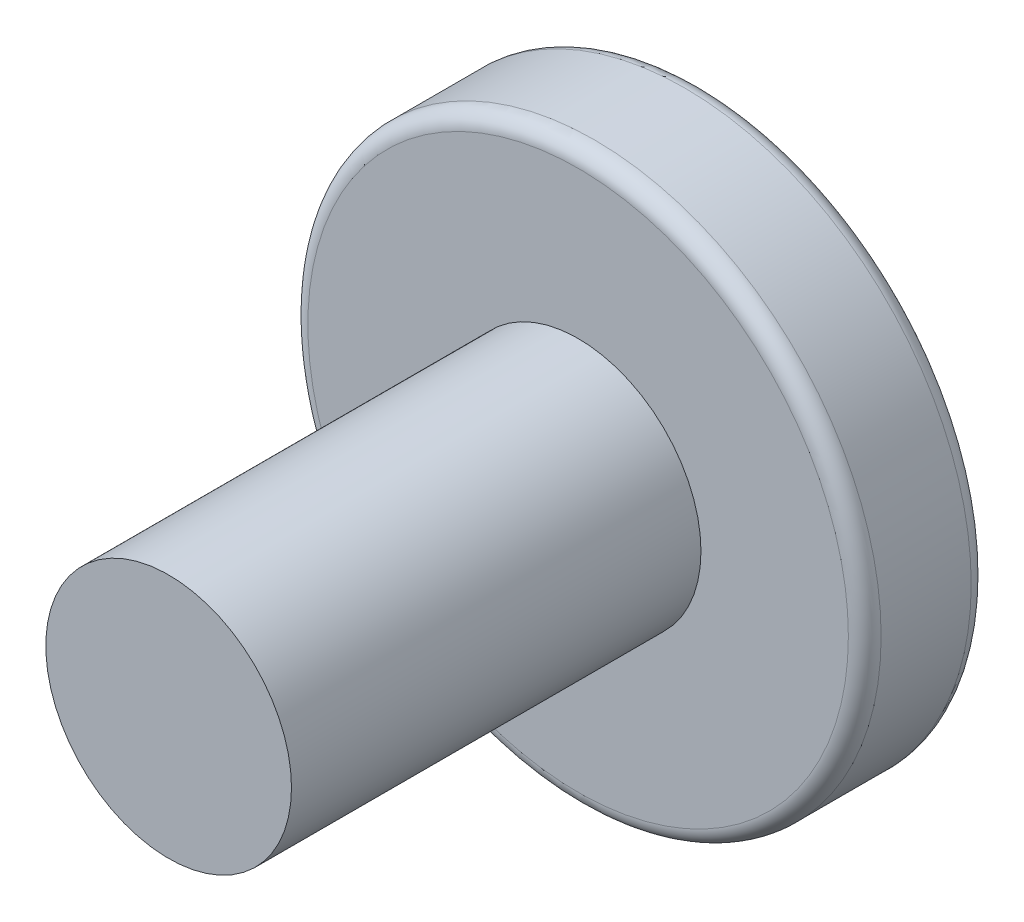
ISO-10303-21;
HEADER;
FILE_DESCRIPTION(('STEP AP214'),'2;1');
FILE_NAME('part.step','',(''),(''),'','','');
FILE_SCHEMA(('AUTOMOTIVE_DESIGN { 1 0 10303 214 1 1 1 1 }'));
ENDSEC;
DATA;
#1=APPLICATION_CONTEXT('core data for automotive mechanical design processes');
#2=APPLICATION_PROTOCOL_DEFINITION('international standard','automotive_design',2000,#1);
#3=PRODUCT_CONTEXT('',#1,'mechanical');
#4=PRODUCT('Part','Part','',(#3));
#5=PRODUCT_RELATED_PRODUCT_CATEGORY('part','',(#4));
#6=PRODUCT_DEFINITION_FORMATION('','',#4);
#7=PRODUCT_DEFINITION_CONTEXT('part definition',#1,'design');
#8=PRODUCT_DEFINITION('design','',#6,#7);
#9=PRODUCT_DEFINITION_SHAPE('','',#8);
#10=(LENGTH_UNIT() NAMED_UNIT(*) SI_UNIT(.MILLI.,.METRE.));
#11=(NAMED_UNIT(*) PLANE_ANGLE_UNIT() SI_UNIT($,.RADIAN.));
#12=(NAMED_UNIT(*) SI_UNIT($,.STERADIAN.) SOLID_ANGLE_UNIT());
#13=UNCERTAINTY_MEASURE_WITH_UNIT(LENGTH_MEASURE(1.E-05),#10,'distance_accuracy_value','');
#14=(GEOMETRIC_REPRESENTATION_CONTEXT(3) GLOBAL_UNCERTAINTY_ASSIGNED_CONTEXT((#13)) GLOBAL_UNIT_ASSIGNED_CONTEXT((#10,
#11,#12)) REPRESENTATION_CONTEXT('',''));
#15=CARTESIAN_POINT('',(0.,0.,0.));
#16=DIRECTION('',(0.,0.,1.));
#17=DIRECTION('',(1.,0.,0.));
#18=AXIS2_PLACEMENT_3D('',#15,#16,#17);
#19=CARTESIAN_POINT('',(0.,0.,1.5));
#20=DIRECTION('',(0.,0.,-1.));
#21=DIRECTION('',(-1.,0.,0.));
#22=AXIS2_PLACEMENT_3D('',#19,#20,#21);
#23=CYLINDRICAL_SURFACE('',#22,3.5);
#24=CARTESIAN_POINT('',(0.,0.,0.2));
#25=DIRECTION('',(0.,0.,1.));
#26=DIRECTION('',(1.,0.,0.));
#27=AXIS2_PLACEMENT_3D('',#24,#25,#26);
#28=CIRCLE('',#27,3.5);
#29=CARTESIAN_POINT('',(3.5,0.,0.2));
#30=VERTEX_POINT('',#29);
#31=EDGE_CURVE('E154',#30,#30,#28,.T.);
#32=ORIENTED_EDGE('',*,*,#31,.T.);
#33=EDGE_LOOP('',(#32));
#34=FACE_BOUND('',#33,.T.);
#35=CARTESIAN_POINT('',(0.,0.,1.3));
#36=DIRECTION('',(0.,0.,1.));
#37=DIRECTION('',(1.,0.,0.));
#38=AXIS2_PLACEMENT_3D('',#35,#36,#37);
#39=CIRCLE('',#38,3.5);
#40=CARTESIAN_POINT('',(3.5,0.,1.3));
#41=VERTEX_POINT('',#40);
#42=EDGE_CURVE('E151',#41,#41,#39,.F.);
#43=ORIENTED_EDGE('',*,*,#42,.T.);
#44=EDGE_LOOP('',(#43));
#45=FACE_BOUND('',#44,.T.);
#46=ADVANCED_FACE('F38',(#34,#45),#23,.T.);
#47=CARTESIAN_POINT('',(0.,0.,1.5));
#48=DIRECTION('',(0.,0.,1.));
#49=DIRECTION('',(1.,0.,0.));
#50=AXIS2_PLACEMENT_3D('',#47,#48,#49);
#51=PLANE('',#50);
#52=CARTESIAN_POINT('',(0.,0.,1.5));
#53=DIRECTION('',(0.,0.,1.));
#54=DIRECTION('',(1.,0.,0.));
#55=AXIS2_PLACEMENT_3D('',#52,#53,#54);
#56=CIRCLE('',#55,3.3);
#57=CARTESIAN_POINT('',(3.3,0.,1.5));
#58=VERTEX_POINT('',#57);
#59=EDGE_CURVE('E11',#58,#58,#56,.T.);
#60=ORIENTED_EDGE('',*,*,#59,.T.);
#61=EDGE_LOOP('',(#60));
#62=FACE_BOUND('',#61,.T.);
#63=CARTESIAN_POINT('',(0.,0.,1.5));
#64=DIRECTION('',(0.,0.,1.));
#65=DIRECTION('',(1.,0.,0.));
#66=AXIS2_PLACEMENT_3D('',#63,#64,#65);
#67=CIRCLE('',#66,1.5);
#68=CARTESIAN_POINT('',(1.5,0.,1.5));
#69=VERTEX_POINT('',#68);
#70=EDGE_CURVE('E148',#69,#69,#67,.T.);
#71=ORIENTED_EDGE('',*,*,#70,.F.);
#72=EDGE_LOOP('',(#71));
#73=FACE_BOUND('',#72,.T.);
#74=ADVANCED_FACE('F169',(#62,#73),#51,.T.);
#75=CARTESIAN_POINT('',(0.,0.,0.));
#76=DIRECTION('',(0.,0.,1.));
#77=DIRECTION('',(1.,0.,0.));
#78=AXIS2_PLACEMENT_3D('',#75,#76,#77);
#79=PLANE('',#78);
#80=DIRECTION('',(0.5,0.866025403784438,0.));
#81=VECTOR('',#80,1.);
#82=CARTESIAN_POINT('',(-1.15470053837925,0.,0.));
#83=LINE('',#82,#81);
#84=CARTESIAN_POINT('',(-1.15470053837925,0.,0.));
#85=VERTEX_POINT('',#84);
#86=CARTESIAN_POINT('',(-0.577350269189626,1.,0.));
#87=VERTEX_POINT('',#86);
#88=EDGE_CURVE('E127',#85,#87,#83,.T.);
#89=ORIENTED_EDGE('',*,*,#88,.F.);
#90=DIRECTION('',(-0.5,0.866025403784439,0.));
#91=VECTOR('',#90,1.);
#92=CARTESIAN_POINT('',(-0.577350269189626,-1.,0.));
#93=LINE('',#92,#91);
#94=CARTESIAN_POINT('',(-0.577350269189626,-1.,0.));
#95=VERTEX_POINT('',#94);
#96=EDGE_CURVE('E53',#95,#85,#93,.T.);
#97=ORIENTED_EDGE('',*,*,#96,.F.);
#98=DIRECTION('',(-1.,0.,0.));
#99=VECTOR('',#98,1.);
#100=CARTESIAN_POINT('',(0.577350269189626,-1.,0.));
#101=LINE('',#100,#99);
#102=CARTESIAN_POINT('',(0.577350269189626,-1.,0.));
#103=VERTEX_POINT('',#102);
#104=EDGE_CURVE('E136',#103,#95,#101,.T.);
#105=ORIENTED_EDGE('',*,*,#104,.F.);
#106=DIRECTION('',(-0.5,-0.866025403784438,0.));
#107=VECTOR('',#106,1.);
#108=CARTESIAN_POINT('',(1.15470053837925,0.,0.));
#109=LINE('',#108,#107);
#110=CARTESIAN_POINT('',(1.15470053837925,0.,0.));
#111=VERTEX_POINT('',#110);
#112=EDGE_CURVE('E134',#111,#103,#109,.T.);
#113=ORIENTED_EDGE('',*,*,#112,.F.);
#114=DIRECTION('',(0.5,-0.866025403784439,0.));
#115=VECTOR('',#114,1.);
#116=CARTESIAN_POINT('',(0.577350269189626,1.,0.));
#117=LINE('',#116,#115);
#118=CARTESIAN_POINT('',(0.577350269189626,1.,0.));
#119=VERTEX_POINT('',#118);
#120=EDGE_CURVE('E101',#119,#111,#117,.T.);
#121=ORIENTED_EDGE('',*,*,#120,.F.);
#122=DIRECTION('',(1.,0.,0.));
#123=VECTOR('',#122,1.);
#124=CARTESIAN_POINT('',(-0.577350269189626,1.,0.));
#125=LINE('',#124,#123);
#126=EDGE_CURVE('E130',#87,#119,#125,.T.);
#127=ORIENTED_EDGE('',*,*,#126,.F.);
#128=EDGE_LOOP('',(#89,#97,#105,#113,#121,#127));
#129=FACE_BOUND('',#128,.T.);
#130=CARTESIAN_POINT('',(0.,0.,0.));
#131=DIRECTION('',(0.,0.,1.));
#132=DIRECTION('',(1.,0.,0.));
#133=AXIS2_PLACEMENT_3D('',#130,#131,#132);
#134=CIRCLE('',#133,3.3);
#135=CARTESIAN_POINT('',(3.3,0.,0.));
#136=VERTEX_POINT('',#135);
#137=EDGE_CURVE('E46',#136,#136,#134,.F.);
#138=ORIENTED_EDGE('',*,*,#137,.T.);
#139=EDGE_LOOP('',(#138));
#140=FACE_BOUND('',#139,.T.);
#141=ADVANCED_FACE('F159',(#129,#140),#79,.F.);
#142=CARTESIAN_POINT('',(0.,0.,6.5));
#143=DIRECTION('',(0.,0.,-1.));
#144=DIRECTION('',(-1.,0.,0.));
#145=AXIS2_PLACEMENT_3D('',#142,#143,#144);
#146=CYLINDRICAL_SURFACE('',#145,1.5);
#147=CARTESIAN_POINT('',(0.,0.,6.5));
#148=DIRECTION('',(0.,0.,1.));
#149=DIRECTION('',(1.,0.,0.));
#150=AXIS2_PLACEMENT_3D('',#147,#148,#149);
#151=CIRCLE('',#150,1.5);
#152=CARTESIAN_POINT('',(1.5,0.,6.5));
#153=VERTEX_POINT('',#152);
#154=EDGE_CURVE('E140',#153,#153,#151,.T.);
#155=ORIENTED_EDGE('',*,*,#154,.F.);
#156=EDGE_LOOP('',(#155));
#157=FACE_BOUND('',#156,.T.);
#158=ORIENTED_EDGE('',*,*,#70,.T.);
#159=EDGE_LOOP('',(#158));
#160=FACE_BOUND('',#159,.T.);
#161=ADVANCED_FACE('F183',(#157,#160),#146,.T.);
#162=CARTESIAN_POINT('',(0.,0.,6.5));
#163=DIRECTION('',(0.,0.,1.));
#164=DIRECTION('',(1.,0.,0.));
#165=AXIS2_PLACEMENT_3D('',#162,#163,#164);
#166=PLANE('',#165);
#167=ORIENTED_EDGE('',*,*,#154,.T.);
#168=EDGE_LOOP('',(#167));
#169=FACE_BOUND('',#168,.T.);
#170=ADVANCED_FACE('F164',(#169),#166,.T.);
#171=CARTESIAN_POINT('',(0.,0.,0.2));
#172=DIRECTION('',(0.,0.,1.));
#173=DIRECTION('',(1.,0.,0.));
#174=AXIS2_PLACEMENT_3D('',#171,#172,#173);
#175=TOROIDAL_SURFACE('',#174,3.3,0.2);
#176=ORIENTED_EDGE('',*,*,#137,.F.);
#177=EDGE_LOOP('',(#176));
#178=FACE_BOUND('',#177,.T.);
#179=ORIENTED_EDGE('',*,*,#31,.F.);
#180=EDGE_LOOP('',(#179));
#181=FACE_BOUND('',#180,.T.);
#182=ADVANCED_FACE('F161',(#178,#181),#175,.T.);
#183=CARTESIAN_POINT('',(0.,0.,1.3));
#184=DIRECTION('',(0.,0.,1.));
#185=DIRECTION('',(1.,0.,0.));
#186=AXIS2_PLACEMENT_3D('',#183,#184,#185);
#187=TOROIDAL_SURFACE('',#186,3.3,0.2);
#188=ORIENTED_EDGE('',*,*,#42,.F.);
#189=EDGE_LOOP('',(#188));
#190=FACE_BOUND('',#189,.T.);
#191=ORIENTED_EDGE('',*,*,#59,.F.);
#192=EDGE_LOOP('',(#191));
#193=FACE_BOUND('',#192,.T.);
#194=ADVANCED_FACE('F40',(#190,#193),#187,.T.);
#195=CARTESIAN_POINT('',(-0.577350269189626,-1.,1.5));
#196=DIRECTION('',(-0.866025403784439,-0.5,0.));
#197=DIRECTION('',(0.5,-0.866025403784439,0.));
#198=AXIS2_PLACEMENT_3D('',#195,#196,#197);
#199=PLANE('',#198);
#200=ORIENTED_EDGE('',*,*,#96,.T.);
#201=DIRECTION('',(0.,0.,-1.));
#202=VECTOR('',#201,1.);
#203=CARTESIAN_POINT('',(-1.15470053837925,0.,1.5));
#204=LINE('',#203,#202);
#205=CARTESIAN_POINT('',(-1.15470053837925,0.,1.5));
#206=VERTEX_POINT('',#205);
#207=EDGE_CURVE('E83',#206,#85,#204,.T.);
#208=ORIENTED_EDGE('',*,*,#207,.F.);
#209=DIRECTION('',(-0.5,0.866025403784439,0.));
#210=VECTOR('',#209,1.);
#211=CARTESIAN_POINT('',(-0.577350269189626,-1.,1.5));
#212=LINE('',#211,#210);
#213=CARTESIAN_POINT('',(-0.577350269189626,-1.,1.5));
#214=VERTEX_POINT('',#213);
#215=EDGE_CURVE('E138',#214,#206,#212,.T.);
#216=ORIENTED_EDGE('',*,*,#215,.F.);
#217=DIRECTION('',(0.,0.,-1.));
#218=VECTOR('',#217,1.);
#219=CARTESIAN_POINT('',(-0.577350269189626,-1.,1.5));
#220=LINE('',#219,#218);
#221=EDGE_CURVE('E61',#214,#95,#220,.T.);
#222=ORIENTED_EDGE('',*,*,#221,.T.);
#223=EDGE_LOOP('',(#200,#208,#216,#222));
#224=FACE_BOUND('',#223,.T.);
#225=ADVANCED_FACE('F175',(#224),#199,.F.);
#226=CARTESIAN_POINT('',(0.577350269189626,-1.,1.5));
#227=DIRECTION('',(0.,-1.,0.));
#228=DIRECTION('',(0.,0.,-1.));
#229=AXIS2_PLACEMENT_3D('',#226,#227,#228);
#230=PLANE('',#229);
#231=ORIENTED_EDGE('',*,*,#104,.T.);
#232=ORIENTED_EDGE('',*,*,#221,.F.);
#233=DIRECTION('',(-1.,0.,0.));
#234=VECTOR('',#233,1.);
#235=CARTESIAN_POINT('',(0.577350269189626,-1.,1.5));
#236=LINE('',#235,#234);
#237=CARTESIAN_POINT('',(0.577350269189626,-1.,1.5));
#238=VERTEX_POINT('',#237);
#239=EDGE_CURVE('E113',#238,#214,#236,.T.);
#240=ORIENTED_EDGE('',*,*,#239,.F.);
#241=DIRECTION('',(0.,0.,-1.));
#242=VECTOR('',#241,1.);
#243=CARTESIAN_POINT('',(0.577350269189626,-1.,1.5));
#244=LINE('',#243,#242);
#245=EDGE_CURVE('E105',#238,#103,#244,.T.);
#246=ORIENTED_EDGE('',*,*,#245,.T.);
#247=EDGE_LOOP('',(#231,#232,#240,#246));
#248=FACE_BOUND('',#247,.T.);
#249=ADVANCED_FACE('F199',(#248),#230,.F.);
#250=CARTESIAN_POINT('',(1.15470053837925,0.,1.5));
#251=DIRECTION('',(0.866025403784439,-0.5,0.));
#252=DIRECTION('',(0.5,0.866025403784439,0.));
#253=AXIS2_PLACEMENT_3D('',#250,#251,#252);
#254=PLANE('',#253);
#255=ORIENTED_EDGE('',*,*,#112,.T.);
#256=ORIENTED_EDGE('',*,*,#245,.F.);
#257=DIRECTION('',(-0.5,-0.866025403784438,0.));
#258=VECTOR('',#257,1.);
#259=CARTESIAN_POINT('',(1.15470053837925,0.,1.5));
#260=LINE('',#259,#258);
#261=CARTESIAN_POINT('',(1.15470053837925,0.,1.5));
#262=VERTEX_POINT('',#261);
#263=EDGE_CURVE('E109',#262,#238,#260,.T.);
#264=ORIENTED_EDGE('',*,*,#263,.F.);
#265=DIRECTION('',(0.,0.,-1.));
#266=VECTOR('',#265,1.);
#267=CARTESIAN_POINT('',(1.15470053837925,0.,1.5));
#268=LINE('',#267,#266);
#269=EDGE_CURVE('E94',#262,#111,#268,.T.);
#270=ORIENTED_EDGE('',*,*,#269,.T.);
#271=EDGE_LOOP('',(#255,#256,#264,#270));
#272=FACE_BOUND('',#271,.T.);
#273=ADVANCED_FACE('F110',(#272),#254,.F.);
#274=CARTESIAN_POINT('',(0.577350269189626,1.,1.5));
#275=DIRECTION('',(0.866025403784439,0.5,0.));
#276=DIRECTION('',(-0.5,0.866025403784439,0.));
#277=AXIS2_PLACEMENT_3D('',#274,#275,#276);
#278=PLANE('',#277);
#279=ORIENTED_EDGE('',*,*,#120,.T.);
#280=ORIENTED_EDGE('',*,*,#269,.F.);
#281=DIRECTION('',(0.5,-0.866025403784439,0.));
#282=VECTOR('',#281,1.);
#283=CARTESIAN_POINT('',(0.577350269189626,1.,1.5));
#284=LINE('',#283,#282);
#285=CARTESIAN_POINT('',(0.577350269189626,1.,1.5));
#286=VERTEX_POINT('',#285);
#287=EDGE_CURVE('E98',#286,#262,#284,.T.);
#288=ORIENTED_EDGE('',*,*,#287,.F.);
#289=DIRECTION('',(0.,0.,-1.));
#290=VECTOR('',#289,1.);
#291=CARTESIAN_POINT('',(0.577350269189626,1.,1.5));
#292=LINE('',#291,#290);
#293=EDGE_CURVE('E106',#286,#119,#292,.T.);
#294=ORIENTED_EDGE('',*,*,#293,.T.);
#295=EDGE_LOOP('',(#279,#280,#288,#294));
#296=FACE_BOUND('',#295,.T.);
#297=ADVANCED_FACE('F96',(#296),#278,.F.);
#298=CARTESIAN_POINT('',(-0.577350269189626,1.,1.5));
#299=DIRECTION('',(0.,1.,0.));
#300=DIRECTION('',(0.,0.,1.));
#301=AXIS2_PLACEMENT_3D('',#298,#299,#300);
#302=PLANE('',#301);
#303=ORIENTED_EDGE('',*,*,#126,.T.);
#304=ORIENTED_EDGE('',*,*,#293,.F.);
#305=DIRECTION('',(1.,0.,0.));
#306=VECTOR('',#305,1.);
#307=CARTESIAN_POINT('',(-0.577350269189626,1.,1.5));
#308=LINE('',#307,#306);
#309=CARTESIAN_POINT('',(-0.577350269189626,1.,1.5));
#310=VERTEX_POINT('',#309);
#311=EDGE_CURVE('E119',#310,#286,#308,.T.);
#312=ORIENTED_EDGE('',*,*,#311,.F.);
#313=DIRECTION('',(0.,0.,-1.));
#314=VECTOR('',#313,1.);
#315=CARTESIAN_POINT('',(-0.577350269189626,1.,1.5));
#316=LINE('',#315,#314);
#317=EDGE_CURVE('E143',#310,#87,#316,.T.);
#318=ORIENTED_EDGE('',*,*,#317,.T.);
#319=EDGE_LOOP('',(#303,#304,#312,#318));
#320=FACE_BOUND('',#319,.T.);
#321=ADVANCED_FACE('F203',(#320),#302,.F.);
#322=CARTESIAN_POINT('',(-1.15470053837925,0.,1.5));
#323=DIRECTION('',(-0.866025403784439,0.5,0.));
#324=DIRECTION('',(-0.5,-0.866025403784439,0.));
#325=AXIS2_PLACEMENT_3D('',#322,#323,#324);
#326=PLANE('',#325);
#327=ORIENTED_EDGE('',*,*,#88,.T.);
#328=ORIENTED_EDGE('',*,*,#317,.F.);
#329=DIRECTION('',(0.5,0.866025403784438,0.));
#330=VECTOR('',#329,1.);
#331=CARTESIAN_POINT('',(-1.15470053837925,0.,1.5));
#332=LINE('',#331,#330);
#333=EDGE_CURVE('E121',#206,#310,#332,.T.);
#334=ORIENTED_EDGE('',*,*,#333,.F.);
#335=ORIENTED_EDGE('',*,*,#207,.T.);
#336=EDGE_LOOP('',(#327,#328,#334,#335));
#337=FACE_BOUND('',#336,.T.);
#338=ADVANCED_FACE('F200',(#337),#326,.F.);
#339=CARTESIAN_POINT('',(0.,0.,1.5));
#340=DIRECTION('',(0.,0.,-1.));
#341=DIRECTION('',(-1.,0.,0.));
#342=AXIS2_PLACEMENT_3D('',#339,#340,#341);
#343=PLANE('',#342);
#344=ORIENTED_EDGE('',*,*,#215,.T.);
#345=ORIENTED_EDGE('',*,*,#333,.T.);
#346=ORIENTED_EDGE('',*,*,#311,.T.);
#347=ORIENTED_EDGE('',*,*,#287,.T.);
#348=ORIENTED_EDGE('',*,*,#263,.T.);
#349=ORIENTED_EDGE('',*,*,#239,.T.);
#350=EDGE_LOOP('',(#344,#345,#346,#347,#348,#349));
#351=FACE_BOUND('',#350,.T.);
#352=ADVANCED_FACE('F116',(#351),#343,.T.);
#353=CLOSED_SHELL('',(#46,#74,#141,#161,#170,#182,#194,#225,#249,#273,#297,#321,#338,#352));
#354=MANIFOLD_SOLID_BREP('B2',#353);
#355=ADVANCED_BREP_SHAPE_REPRESENTATION('',(#18,#354),#14);
#356=SHAPE_DEFINITION_REPRESENTATION(#9,#355);
ENDSEC;
END-ISO-10303-21;
